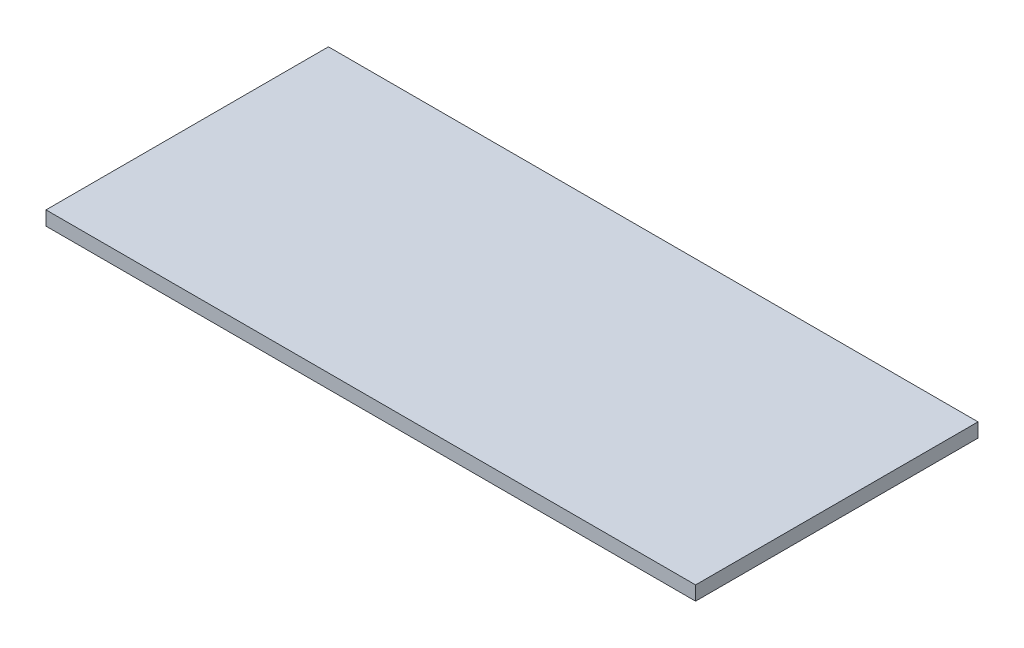
ISO-10303-21;
HEADER;
FILE_DESCRIPTION(('STEP AP214'),'2;1');
FILE_NAME('part.step','',(''),(''),'','','');
FILE_SCHEMA(('AUTOMOTIVE_DESIGN { 1 0 10303 214 1 1 1 1 }'));
ENDSEC;
DATA;
#1=APPLICATION_CONTEXT('core data for automotive mechanical design processes');
#2=APPLICATION_PROTOCOL_DEFINITION('international standard','automotive_design',2000,#1);
#3=PRODUCT_CONTEXT('',#1,'mechanical');
#4=PRODUCT('Part','Part','',(#3));
#5=PRODUCT_RELATED_PRODUCT_CATEGORY('part','',(#4));
#6=PRODUCT_DEFINITION_FORMATION('','',#4);
#7=PRODUCT_DEFINITION_CONTEXT('part definition',#1,'design');
#8=PRODUCT_DEFINITION('design','',#6,#7);
#9=PRODUCT_DEFINITION_SHAPE('','',#8);
#10=(LENGTH_UNIT() NAMED_UNIT(*) SI_UNIT(.MILLI.,.METRE.));
#11=(NAMED_UNIT(*) PLANE_ANGLE_UNIT() SI_UNIT($,.RADIAN.));
#12=(NAMED_UNIT(*) SI_UNIT($,.STERADIAN.) SOLID_ANGLE_UNIT());
#13=UNCERTAINTY_MEASURE_WITH_UNIT(LENGTH_MEASURE(1.E-05),#10,'distance_accuracy_value','');
#14=(GEOMETRIC_REPRESENTATION_CONTEXT(3) GLOBAL_UNCERTAINTY_ASSIGNED_CONTEXT((#13)) GLOBAL_UNIT_ASSIGNED_CONTEXT((#10,
#11,#12)) REPRESENTATION_CONTEXT('',''));
#15=CARTESIAN_POINT('',(0.,0.,0.));
#16=DIRECTION('',(0.,0.,1.));
#17=DIRECTION('',(1.,0.,0.));
#18=AXIS2_PLACEMENT_3D('',#15,#16,#17);
#19=CARTESIAN_POINT('',(292.1,12.7,254.));
#20=DIRECTION('',(-1.,0.,0.));
#21=DIRECTION('',(0.,0.,1.));
#22=AXIS2_PLACEMENT_3D('',#19,#20,#21);
#23=PLANE('',#22);
#24=DIRECTION('',(0.,0.,-1.));
#25=VECTOR('',#24,1.);
#26=CARTESIAN_POINT('',(292.1,0.,254.));
#27=LINE('',#26,#25);
#28=CARTESIAN_POINT('',(292.1,0.,254.));
#29=VERTEX_POINT('',#28);
#30=CARTESIAN_POINT('',(292.1,0.,0.));
#31=VERTEX_POINT('',#30);
#32=EDGE_CURVE('E96',#29,#31,#27,.T.);
#33=ORIENTED_EDGE('',*,*,#32,.T.);
#34=DIRECTION('',(0.,-1.,0.));
#35=VECTOR('',#34,1.);
#36=CARTESIAN_POINT('',(292.1,12.7,0.));
#37=LINE('',#36,#35);
#38=CARTESIAN_POINT('',(292.1,12.7,0.));
#39=VERTEX_POINT('',#38);
#40=EDGE_CURVE('E11',#39,#31,#37,.T.);
#41=ORIENTED_EDGE('',*,*,#40,.F.);
#42=DIRECTION('',(0.,0.,-1.));
#43=VECTOR('',#42,1.);
#44=CARTESIAN_POINT('',(292.1,12.7,254.));
#45=LINE('',#44,#43);
#46=CARTESIAN_POINT('',(292.1,12.7,254.));
#47=VERTEX_POINT('',#46);
#48=EDGE_CURVE('E84',#47,#39,#45,.T.);
#49=ORIENTED_EDGE('',*,*,#48,.F.);
#50=DIRECTION('',(0.,-1.,0.));
#51=VECTOR('',#50,1.);
#52=CARTESIAN_POINT('',(292.1,12.7,254.));
#53=LINE('',#52,#51);
#54=EDGE_CURVE('E92',#47,#29,#53,.T.);
#55=ORIENTED_EDGE('',*,*,#54,.T.);
#56=EDGE_LOOP('',(#33,#41,#49,#55));
#57=FACE_BOUND('',#56,.T.);
#58=ADVANCED_FACE('F33',(#57),#23,.F.);
#59=CARTESIAN_POINT('',(-292.1,12.7,0.));
#60=DIRECTION('',(0.,0.,1.));
#61=DIRECTION('',(1.,0.,0.));
#62=AXIS2_PLACEMENT_3D('',#59,#60,#61);
#63=PLANE('',#62);
#64=DIRECTION('',(-1.,0.,0.));
#65=VECTOR('',#64,1.);
#66=CARTESIAN_POINT('',(-292.1,0.,0.));
#67=LINE('',#66,#65);
#68=CARTESIAN_POINT('',(-292.1,0.,0.));
#69=VERTEX_POINT('',#68);
#70=EDGE_CURVE('E88',#31,#69,#67,.T.);
#71=ORIENTED_EDGE('',*,*,#70,.T.);
#72=DIRECTION('',(0.,-1.,0.));
#73=VECTOR('',#72,1.);
#74=CARTESIAN_POINT('',(-292.1,12.7,0.));
#75=LINE('',#74,#73);
#76=CARTESIAN_POINT('',(-292.1,12.7,0.));
#77=VERTEX_POINT('',#76);
#78=EDGE_CURVE('E41',#77,#69,#75,.T.);
#79=ORIENTED_EDGE('',*,*,#78,.F.);
#80=DIRECTION('',(-1.,0.,0.));
#81=VECTOR('',#80,1.);
#82=CARTESIAN_POINT('',(-292.1,12.7,0.));
#83=LINE('',#82,#81);
#84=EDGE_CURVE('E79',#39,#77,#83,.T.);
#85=ORIENTED_EDGE('',*,*,#84,.F.);
#86=ORIENTED_EDGE('',*,*,#40,.T.);
#87=EDGE_LOOP('',(#71,#79,#85,#86));
#88=FACE_BOUND('',#87,.T.);
#89=ADVANCED_FACE('F87',(#88),#63,.F.);
#90=CARTESIAN_POINT('',(-292.1,12.7,254.));
#91=DIRECTION('',(1.,0.,0.));
#92=DIRECTION('',(0.,0.,-1.));
#93=AXIS2_PLACEMENT_3D('',#90,#91,#92);
#94=PLANE('',#93);
#95=DIRECTION('',(0.,0.,1.));
#96=VECTOR('',#95,1.);
#97=CARTESIAN_POINT('',(-292.1,0.,254.));
#98=LINE('',#97,#96);
#99=CARTESIAN_POINT('',(-292.1,0.,254.));
#100=VERTEX_POINT('',#99);
#101=EDGE_CURVE('E66',#69,#100,#98,.T.);
#102=ORIENTED_EDGE('',*,*,#101,.T.);
#103=DIRECTION('',(0.,-1.,0.));
#104=VECTOR('',#103,1.);
#105=CARTESIAN_POINT('',(-292.1,12.7,254.));
#106=LINE('',#105,#104);
#107=CARTESIAN_POINT('',(-292.1,12.7,254.));
#108=VERTEX_POINT('',#107);
#109=EDGE_CURVE('E89',#108,#100,#106,.T.);
#110=ORIENTED_EDGE('',*,*,#109,.F.);
#111=DIRECTION('',(0.,0.,1.));
#112=VECTOR('',#111,1.);
#113=CARTESIAN_POINT('',(-292.1,12.7,254.));
#114=LINE('',#113,#112);
#115=EDGE_CURVE('E82',#77,#108,#114,.T.);
#116=ORIENTED_EDGE('',*,*,#115,.F.);
#117=ORIENTED_EDGE('',*,*,#78,.T.);
#118=EDGE_LOOP('',(#102,#110,#116,#117));
#119=FACE_BOUND('',#118,.T.);
#120=ADVANCED_FACE('F90',(#119),#94,.F.);
#121=CARTESIAN_POINT('',(-292.1,12.7,254.));
#122=DIRECTION('',(0.,0.,-1.));
#123=DIRECTION('',(-1.,0.,0.));
#124=AXIS2_PLACEMENT_3D('',#121,#122,#123);
#125=PLANE('',#124);
#126=DIRECTION('',(1.,0.,0.));
#127=VECTOR('',#126,1.);
#128=CARTESIAN_POINT('',(-292.1,0.,254.));
#129=LINE('',#128,#127);
#130=EDGE_CURVE('E72',#100,#29,#129,.T.);
#131=ORIENTED_EDGE('',*,*,#130,.T.);
#132=ORIENTED_EDGE('',*,*,#54,.F.);
#133=DIRECTION('',(1.,0.,0.));
#134=VECTOR('',#133,1.);
#135=CARTESIAN_POINT('',(-292.1,12.7,254.));
#136=LINE('',#135,#134);
#137=EDGE_CURVE('E49',#108,#47,#136,.T.);
#138=ORIENTED_EDGE('',*,*,#137,.F.);
#139=ORIENTED_EDGE('',*,*,#109,.T.);
#140=EDGE_LOOP('',(#131,#132,#138,#139));
#141=FACE_BOUND('',#140,.T.);
#142=ADVANCED_FACE('F103',(#141),#125,.F.);
#143=CARTESIAN_POINT('',(0.,12.7,0.));
#144=DIRECTION('',(0.,-1.,0.));
#145=DIRECTION('',(0.,0.,-1.));
#146=AXIS2_PLACEMENT_3D('',#143,#144,#145);
#147=PLANE('',#146);
#148=ORIENTED_EDGE('',*,*,#48,.T.);
#149=ORIENTED_EDGE('',*,*,#84,.T.);
#150=ORIENTED_EDGE('',*,*,#115,.T.);
#151=ORIENTED_EDGE('',*,*,#137,.T.);
#152=EDGE_LOOP('',(#148,#149,#150,#151));
#153=FACE_BOUND('',#152,.T.);
#154=ADVANCED_FACE('F80',(#153),#147,.F.);
#155=CARTESIAN_POINT('',(0.,0.,0.));
#156=DIRECTION('',(0.,-1.,0.));
#157=DIRECTION('',(0.,0.,-1.));
#158=AXIS2_PLACEMENT_3D('',#155,#156,#157);
#159=PLANE('',#158);
#160=ORIENTED_EDGE('',*,*,#32,.F.);
#161=ORIENTED_EDGE('',*,*,#130,.F.);
#162=ORIENTED_EDGE('',*,*,#101,.F.);
#163=ORIENTED_EDGE('',*,*,#70,.F.);
#164=EDGE_LOOP('',(#160,#161,#162,#163));
#165=FACE_BOUND('',#164,.T.);
#166=ADVANCED_FACE('F106',(#165),#159,.T.);
#167=CLOSED_SHELL('',(#58,#89,#120,#142,#154,#166));
#168=MANIFOLD_SOLID_BREP('B2',#167);
#169=ADVANCED_BREP_SHAPE_REPRESENTATION('',(#18,#168),#14);
#170=SHAPE_DEFINITION_REPRESENTATION(#9,#169);
ENDSEC;
END-ISO-10303-21;
